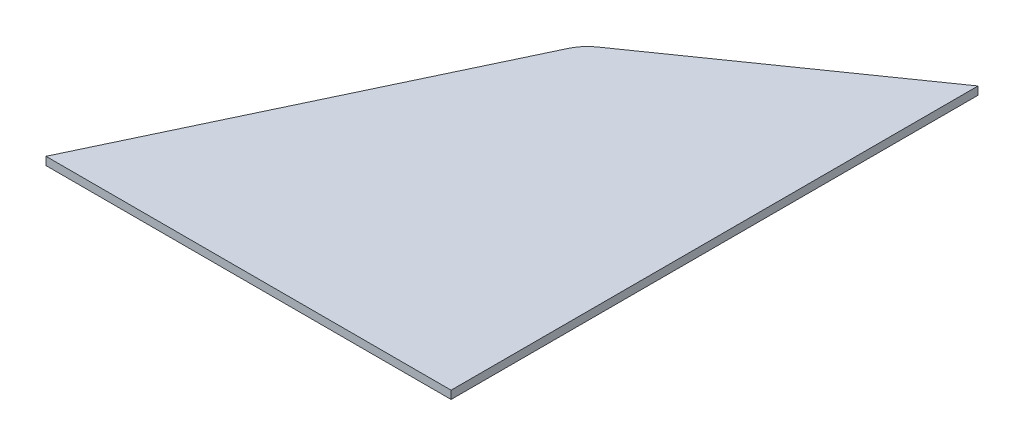
ISO-10303-21;
HEADER;
FILE_DESCRIPTION(('STEP AP214'),'2;1');
FILE_NAME('part.step','',(''),(''),'','','');
FILE_SCHEMA(('AUTOMOTIVE_DESIGN { 1 0 10303 214 1 1 1 1 }'));
ENDSEC;
DATA;
#1=APPLICATION_CONTEXT('core data for automotive mechanical design processes');
#2=APPLICATION_PROTOCOL_DEFINITION('international standard','automotive_design',2000,#1);
#3=PRODUCT_CONTEXT('',#1,'mechanical');
#4=PRODUCT('Part','Part','',(#3));
#5=PRODUCT_RELATED_PRODUCT_CATEGORY('part','',(#4));
#6=PRODUCT_DEFINITION_FORMATION('','',#4);
#7=PRODUCT_DEFINITION_CONTEXT('part definition',#1,'design');
#8=PRODUCT_DEFINITION('design','',#6,#7);
#9=PRODUCT_DEFINITION_SHAPE('','',#8);
#10=(LENGTH_UNIT() NAMED_UNIT(*) SI_UNIT(.MILLI.,.METRE.));
#11=(NAMED_UNIT(*) PLANE_ANGLE_UNIT() SI_UNIT($,.RADIAN.));
#12=(NAMED_UNIT(*) SI_UNIT($,.STERADIAN.) SOLID_ANGLE_UNIT());
#13=UNCERTAINTY_MEASURE_WITH_UNIT(LENGTH_MEASURE(1.E-05),#10,'distance_accuracy_value','');
#14=(GEOMETRIC_REPRESENTATION_CONTEXT(3) GLOBAL_UNCERTAINTY_ASSIGNED_CONTEXT((#13)) GLOBAL_UNIT_ASSIGNED_CONTEXT((#10,
#11,#12)) REPRESENTATION_CONTEXT('',''));
#15=CARTESIAN_POINT('',(0.,0.,0.));
#16=DIRECTION('',(0.,0.,1.));
#17=DIRECTION('',(1.,0.,0.));
#18=AXIS2_PLACEMENT_3D('',#15,#16,#17);
#19=CARTESIAN_POINT('',(42.5645026995307,2.,-90.));
#20=DIRECTION('',(0.903998327362129,0.,0.427535991615295));
#21=DIRECTION('',(0.427535991615295,0.,-0.903998327362129));
#22=AXIS2_PLACEMENT_3D('',#19,#20,#21);
#23=PLANE('',#22);
#24=DIRECTION('',(-0.427535991615295,0.,0.903998327362129));
#25=VECTOR('',#24,1.);
#26=CARTESIAN_POINT('',(42.5645026995307,2.,-90.));
#27=LINE('',#26,#25);
#28=CARTESIAN_POINT('',(41.4290446959055,2.,-87.5991445019891));
#29=VERTEX_POINT('',#28);
#30=CARTESIAN_POINT('',(0.,2.,0.));
#31=VERTEX_POINT('',#30);
#32=EDGE_CURVE('E85',#29,#31,#27,.T.);
#33=ORIENTED_EDGE('',*,*,#32,.F.);
#34=DIRECTION('',(0.,-1.,0.));
#35=VECTOR('',#34,1.);
#36=CARTESIAN_POINT('',(41.4290446959055,2.,-87.5991445019891));
#37=LINE('',#36,#35);
#38=CARTESIAN_POINT('',(41.4290446959055,0.,-87.5991445019891));
#39=VERTEX_POINT('',#38);
#40=EDGE_CURVE('E111',#29,#39,#37,.T.);
#41=ORIENTED_EDGE('',*,*,#40,.T.);
#42=DIRECTION('',(-0.427535991615295,0.,0.903998327362129));
#43=VECTOR('',#42,1.);
#44=CARTESIAN_POINT('',(42.5645026995307,0.,-90.));
#45=LINE('',#44,#43);
#46=CARTESIAN_POINT('',(0.,0.,0.));
#47=VERTEX_POINT('',#46);
#48=EDGE_CURVE('E108',#39,#47,#45,.T.);
#49=ORIENTED_EDGE('',*,*,#48,.T.);
#50=DIRECTION('',(0.,-1.,0.));
#51=VECTOR('',#50,1.);
#52=CARTESIAN_POINT('',(0.,2.,0.));
#53=LINE('',#52,#51);
#54=EDGE_CURVE('E101',#31,#47,#53,.T.);
#55=ORIENTED_EDGE('',*,*,#54,.F.);
#56=EDGE_LOOP('',(#33,#41,#49,#55));
#57=FACE_BOUND('',#56,.T.);
#58=ADVANCED_FACE('F38',(#57),#23,.F.);
#59=CARTESIAN_POINT('',(0.,2.,0.));
#60=DIRECTION('',(0.,0.,-1.));
#61=DIRECTION('',(-1.,0.,0.));
#62=AXIS2_PLACEMENT_3D('',#59,#60,#61);
#63=PLANE('',#62);
#64=DIRECTION('',(1.,0.,0.));
#65=VECTOR('',#64,1.);
#66=CARTESIAN_POINT('',(0.,0.,0.));
#67=LINE('',#66,#65);
#68=CARTESIAN_POINT('',(100.1,0.,0.));
#69=VERTEX_POINT('',#68);
#70=EDGE_CURVE('E131',#47,#69,#67,.T.);
#71=ORIENTED_EDGE('',*,*,#70,.T.);
#72=DIRECTION('',(0.,-1.,0.));
#73=VECTOR('',#72,1.);
#74=CARTESIAN_POINT('',(100.1,2.,0.));
#75=LINE('',#74,#73);
#76=CARTESIAN_POINT('',(100.1,2.,0.));
#77=VERTEX_POINT('',#76);
#78=EDGE_CURVE('E103',#77,#69,#75,.T.);
#79=ORIENTED_EDGE('',*,*,#78,.F.);
#80=DIRECTION('',(1.,0.,0.));
#81=VECTOR('',#80,1.);
#82=CARTESIAN_POINT('',(0.,2.,0.));
#83=LINE('',#82,#81);
#84=EDGE_CURVE('E88',#31,#77,#83,.T.);
#85=ORIENTED_EDGE('',*,*,#84,.F.);
#86=ORIENTED_EDGE('',*,*,#54,.T.);
#87=EDGE_LOOP('',(#71,#79,#85,#86));
#88=FACE_BOUND('',#87,.T.);
#89=ADVANCED_FACE('F100',(#88),#63,.F.);
#90=CARTESIAN_POINT('',(100.1,2.,0.));
#91=DIRECTION('',(-1.,0.,0.));
#92=DIRECTION('',(0.,0.,1.));
#93=AXIS2_PLACEMENT_3D('',#90,#91,#92);
#94=PLANE('',#93);
#95=DIRECTION('',(0.,0.,-1.));
#96=VECTOR('',#95,1.);
#97=CARTESIAN_POINT('',(100.1,0.,0.));
#98=LINE('',#97,#96);
#99=CARTESIAN_POINT('',(100.1,0.,-130.2));
#100=VERTEX_POINT('',#99);
#101=EDGE_CURVE('E128',#69,#100,#98,.T.);
#102=ORIENTED_EDGE('',*,*,#101,.T.);
#103=DIRECTION('',(0.,-1.,0.));
#104=VECTOR('',#103,1.);
#105=CARTESIAN_POINT('',(100.1,2.,-130.2));
#106=LINE('',#105,#104);
#107=CARTESIAN_POINT('',(100.1,2.,-130.2));
#108=VERTEX_POINT('',#107);
#109=EDGE_CURVE('E116',#108,#100,#106,.T.);
#110=ORIENTED_EDGE('',*,*,#109,.F.);
#111=DIRECTION('',(0.,0.,-1.));
#112=VECTOR('',#111,1.);
#113=CARTESIAN_POINT('',(100.1,2.,0.));
#114=LINE('',#113,#112);
#115=EDGE_CURVE('E106',#77,#108,#114,.T.);
#116=ORIENTED_EDGE('',*,*,#115,.F.);
#117=ORIENTED_EDGE('',*,*,#78,.T.);
#118=EDGE_LOOP('',(#102,#110,#116,#117));
#119=FACE_BOUND('',#118,.T.);
#120=ADVANCED_FACE('F141',(#119),#94,.F.);
#121=CARTESIAN_POINT('',(100.1,2.,-130.2));
#122=DIRECTION('',(0.572746425707778,0.,0.81973259776525));
#123=DIRECTION('',(0.81973259776525,0.,-0.572746425707778));
#124=AXIS2_PLACEMENT_3D('',#121,#122,#123);
#125=PLANE('',#124);
#126=DIRECTION('',(-0.81973259776525,0.,0.572746425707778));
#127=VECTOR('',#126,1.);
#128=CARTESIAN_POINT('',(100.1,0.,-130.2));
#129=LINE('',#128,#127);
#130=CARTESIAN_POINT('',(44.741563712449,0.,-91.5211105634887));
#131=VERTEX_POINT('',#130);
#132=EDGE_CURVE('E96',#100,#131,#129,.T.);
#133=ORIENTED_EDGE('',*,*,#132,.T.);
#134=DIRECTION('',(0.,-1.,0.));
#135=VECTOR('',#134,1.);
#136=CARTESIAN_POINT('',(44.741563712449,2.,-91.5211105634887));
#137=LINE('',#136,#135);
#138=CARTESIAN_POINT('',(44.741563712449,2.,-91.5211105634887));
#139=VERTEX_POINT('',#138);
#140=EDGE_CURVE('E47',#131,#139,#137,.F.);
#141=ORIENTED_EDGE('',*,*,#140,.T.);
#142=DIRECTION('',(-0.81973259776525,0.,0.572746425707778));
#143=VECTOR('',#142,1.);
#144=CARTESIAN_POINT('',(100.1,2.,-130.2));
#145=LINE('',#144,#143);
#146=EDGE_CURVE('E125',#108,#139,#145,.T.);
#147=ORIENTED_EDGE('',*,*,#146,.F.);
#148=ORIENTED_EDGE('',*,*,#109,.T.);
#149=EDGE_LOOP('',(#133,#141,#147,#148));
#150=FACE_BOUND('',#149,.T.);
#151=ADVANCED_FACE('F143',(#150),#125,.F.);
#152=CARTESIAN_POINT('',(0.,2.,0.));
#153=DIRECTION('',(0.,1.,0.));
#154=DIRECTION('',(0.,0.,1.));
#155=AXIS2_PLACEMENT_3D('',#152,#153,#154);
#156=PLANE('',#155);
#157=ORIENTED_EDGE('',*,*,#146,.T.);
#158=CARTESIAN_POINT('',(50.4690279695268,2.,-83.3237845858362));
#159=DIRECTION('',(0.,1.,0.));
#160=DIRECTION('',(0.,0.,1.));
#161=AXIS2_PLACEMENT_3D('',#158,#159,#160);
#162=CIRCLE('',#161,10.);
#163=EDGE_CURVE('E11',#139,#29,#162,.T.);
#164=ORIENTED_EDGE('',*,*,#163,.T.);
#165=ORIENTED_EDGE('',*,*,#32,.T.);
#166=ORIENTED_EDGE('',*,*,#84,.T.);
#167=ORIENTED_EDGE('',*,*,#115,.T.);
#168=EDGE_LOOP('',(#157,#164,#165,#166,#167));
#169=FACE_BOUND('',#168,.T.);
#170=ADVANCED_FACE('F87',(#169),#156,.T.);
#171=CARTESIAN_POINT('',(0.,0.,0.));
#172=DIRECTION('',(0.,1.,0.));
#173=DIRECTION('',(0.,0.,1.));
#174=AXIS2_PLACEMENT_3D('',#171,#172,#173);
#175=PLANE('',#174);
#176=ORIENTED_EDGE('',*,*,#48,.F.);
#177=CARTESIAN_POINT('',(50.4690279695268,0.,-83.3237845858362));
#178=DIRECTION('',(0.,1.,0.));
#179=DIRECTION('',(0.,0.,1.));
#180=AXIS2_PLACEMENT_3D('',#177,#178,#179);
#181=CIRCLE('',#180,10.);
#182=EDGE_CURVE('E61',#39,#131,#181,.F.);
#183=ORIENTED_EDGE('',*,*,#182,.T.);
#184=ORIENTED_EDGE('',*,*,#132,.F.);
#185=ORIENTED_EDGE('',*,*,#101,.F.);
#186=ORIENTED_EDGE('',*,*,#70,.F.);
#187=EDGE_LOOP('',(#176,#183,#184,#185,#186));
#188=FACE_BOUND('',#187,.T.);
#189=ADVANCED_FACE('F150',(#188),#175,.F.);
#190=CARTESIAN_POINT('',(50.4690279695268,2.,-83.3237845858362));
#191=DIRECTION('',(0.,-1.,0.));
#192=DIRECTION('',(0.,0.,-1.));
#193=AXIS2_PLACEMENT_3D('',#190,#191,#192);
#194=CYLINDRICAL_SURFACE('',#193,10.);
#195=ORIENTED_EDGE('',*,*,#163,.F.);
#196=ORIENTED_EDGE('',*,*,#140,.F.);
#197=ORIENTED_EDGE('',*,*,#182,.F.);
#198=ORIENTED_EDGE('',*,*,#40,.F.);
#199=EDGE_LOOP('',(#195,#196,#197,#198));
#200=FACE_BOUND('',#199,.T.);
#201=ADVANCED_FACE('F40',(#200),#194,.T.);
#202=CLOSED_SHELL('',(#58,#89,#120,#151,#170,#189,#201));
#203=MANIFOLD_SOLID_BREP('B2',#202);
#204=ADVANCED_BREP_SHAPE_REPRESENTATION('',(#18,#203),#14);
#205=SHAPE_DEFINITION_REPRESENTATION(#9,#204);
ENDSEC;
END-ISO-10303-21;
